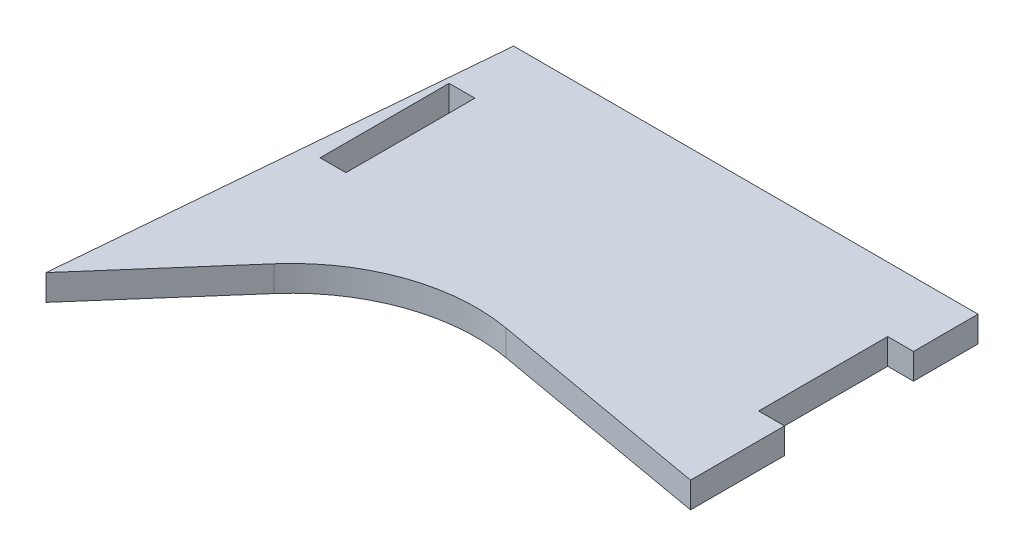
ISO-10303-21;
HEADER;
FILE_DESCRIPTION(('STEP AP214'),'2;1');
FILE_NAME('part.step','',(''),(''),'','','');
FILE_SCHEMA(('AUTOMOTIVE_DESIGN { 1 0 10303 214 1 1 1 1 }'));
ENDSEC;
DATA;
#1=APPLICATION_CONTEXT('core data for automotive mechanical design processes');
#2=APPLICATION_PROTOCOL_DEFINITION('international standard','automotive_design',2000,#1);
#3=PRODUCT_CONTEXT('',#1,'mechanical');
#4=PRODUCT('Part','Part','',(#3));
#5=PRODUCT_RELATED_PRODUCT_CATEGORY('part','',(#4));
#6=PRODUCT_DEFINITION_FORMATION('','',#4);
#7=PRODUCT_DEFINITION_CONTEXT('part definition',#1,'design');
#8=PRODUCT_DEFINITION('design','',#6,#7);
#9=PRODUCT_DEFINITION_SHAPE('','',#8);
#10=(LENGTH_UNIT() NAMED_UNIT(*) SI_UNIT(.MILLI.,.METRE.));
#11=(NAMED_UNIT(*) PLANE_ANGLE_UNIT() SI_UNIT($,.RADIAN.));
#12=(NAMED_UNIT(*) SI_UNIT($,.STERADIAN.) SOLID_ANGLE_UNIT());
#13=UNCERTAINTY_MEASURE_WITH_UNIT(LENGTH_MEASURE(1.E-05),#10,'distance_accuracy_value','');
#14=(GEOMETRIC_REPRESENTATION_CONTEXT(3) GLOBAL_UNCERTAINTY_ASSIGNED_CONTEXT((#13)) GLOBAL_UNIT_ASSIGNED_CONTEXT((#10,
#11,#12)) REPRESENTATION_CONTEXT('',''));
#15=CARTESIAN_POINT('',(0.,0.,0.));
#16=DIRECTION('',(0.,0.,1.));
#17=DIRECTION('',(1.,0.,0.));
#18=AXIS2_PLACEMENT_3D('',#15,#16,#17);
#19=CARTESIAN_POINT('',(-29.8146519361316,3.,50.));
#20=DIRECTION('',(0.,-1.,0.));
#21=DIRECTION('',(0.,0.,-1.));
#22=AXIS2_PLACEMENT_3D('',#19,#20,#21);
#23=PLANE('',#22);
#24=DIRECTION('',(0.,0.,-1.));
#25=VECTOR('',#24,1.);
#26=CARTESIAN_POINT('',(0.,3.,0.));
#27=LINE('',#26,#25);
#28=CARTESIAN_POINT('',(0.,3.,7.5));
#29=VERTEX_POINT('',#28);
#30=CARTESIAN_POINT('',(0.,3.,0.));
#31=VERTEX_POINT('',#30);
#32=EDGE_CURVE('E176',#29,#31,#27,.T.);
#33=ORIENTED_EDGE('',*,*,#32,.T.);
#34=DIRECTION('',(-1.,0.,0.));
#35=VECTOR('',#34,1.);
#36=CARTESIAN_POINT('',(0.,3.,0.));
#37=LINE('',#36,#35);
#38=CARTESIAN_POINT('',(-54.,3.,0.));
#39=VERTEX_POINT('',#38);
#40=EDGE_CURVE('E179',#31,#39,#37,.T.);
#41=ORIENTED_EDGE('',*,*,#40,.T.);
#42=DIRECTION('',(-0.0871557427476548,0.,0.996194698091746));
#43=VECTOR('',#42,1.);
#44=CARTESIAN_POINT('',(-54.,3.,0.));
#45=LINE('',#44,#43);
#46=CARTESIAN_POINT('',(-58.374433176296,3.,50.));
#47=VERTEX_POINT('',#46);
#48=EDGE_CURVE('E182',#39,#47,#45,.T.);
#49=ORIENTED_EDGE('',*,*,#48,.T.);
#50=DIRECTION('',(0.658241438493332,0.,-0.752806886691553));
#51=VECTOR('',#50,1.);
#52=CARTESIAN_POINT('',(-58.374433176296,3.,50.));
#53=LINE('',#52,#51);
#54=CARTESIAN_POINT('',(-46.,3.,35.8478090723934));
#55=VERTEX_POINT('',#54);
#56=EDGE_CURVE('E184',#47,#55,#53,.T.);
#57=ORIENTED_EDGE('',*,*,#56,.T.);
#58=CARTESIAN_POINT('',(-29.8146519361316,3.,50.));
#59=DIRECTION('',(0.,-1.,0.));
#60=DIRECTION('',(0.,0.,-1.));
#61=AXIS2_PLACEMENT_3D('',#58,#59,#60);
#62=CIRCLE('',#61,21.5);
#63=CARTESIAN_POINT('',(-26.0812161162925,3.,28.8266333102375));
#64=VERTEX_POINT('',#63);
#65=EDGE_CURVE('E186',#55,#64,#62,.T.);
#66=ORIENTED_EDGE('',*,*,#65,.T.);
#67=DIRECTION('',(0.984807753012207,0.,0.173648177666934));
#68=VECTOR('',#67,1.);
#69=CARTESIAN_POINT('',(0.,3.,33.4254554012285));
#70=LINE('',#69,#68);
#71=CARTESIAN_POINT('',(0.,3.,33.4254554012285));
#72=VERTEX_POINT('',#71);
#73=EDGE_CURVE('E188',#64,#72,#70,.T.);
#74=ORIENTED_EDGE('',*,*,#73,.T.);
#75=DIRECTION('',(0.,0.,-1.));
#76=VECTOR('',#75,1.);
#77=CARTESIAN_POINT('',(0.,3.,22.5));
#78=LINE('',#77,#76);
#79=CARTESIAN_POINT('',(0.,3.,22.5));
#80=VERTEX_POINT('',#79);
#81=EDGE_CURVE('E190',#72,#80,#78,.T.);
#82=ORIENTED_EDGE('',*,*,#81,.T.);
#83=DIRECTION('',(-1.,0.,0.));
#84=VECTOR('',#83,1.);
#85=CARTESIAN_POINT('',(0.,3.,22.5));
#86=LINE('',#85,#84);
#87=CARTESIAN_POINT('',(-3.,3.,22.5));
#88=VERTEX_POINT('',#87);
#89=EDGE_CURVE('E192',#80,#88,#86,.T.);
#90=ORIENTED_EDGE('',*,*,#89,.T.);
#91=DIRECTION('',(0.,0.,-1.));
#92=VECTOR('',#91,1.);
#93=CARTESIAN_POINT('',(-3.,3.,7.5));
#94=LINE('',#93,#92);
#95=CARTESIAN_POINT('',(-3.,3.,7.5));
#96=VERTEX_POINT('',#95);
#97=EDGE_CURVE('E194',#88,#96,#94,.T.);
#98=ORIENTED_EDGE('',*,*,#97,.T.);
#99=DIRECTION('',(1.,0.,0.));
#100=VECTOR('',#99,1.);
#101=CARTESIAN_POINT('',(0.,3.,7.5));
#102=LINE('',#101,#100);
#103=EDGE_CURVE('E196',#96,#29,#102,.T.);
#104=ORIENTED_EDGE('',*,*,#103,.T.);
#105=EDGE_LOOP('',(#33,#41,#49,#57,#66,#74,#82,#90,#98,#104));
#106=FACE_BOUND('',#105,.T.);
#107=DIRECTION('',(0.,0.,-1.));
#108=VECTOR('',#107,1.);
#109=CARTESIAN_POINT('',(-51.,3.,7.5));
#110=LINE('',#109,#108);
#111=CARTESIAN_POINT('',(-51.,3.,22.5));
#112=VERTEX_POINT('',#111);
#113=CARTESIAN_POINT('',(-51.,3.,7.5));
#114=VERTEX_POINT('',#113);
#115=EDGE_CURVE('E140',#112,#114,#110,.T.);
#116=ORIENTED_EDGE('',*,*,#115,.F.);
#117=DIRECTION('',(1.,0.,0.));
#118=VECTOR('',#117,1.);
#119=CARTESIAN_POINT('',(-54.,3.,22.5));
#120=LINE('',#119,#118);
#121=CARTESIAN_POINT('',(-54.,3.,22.5));
#122=VERTEX_POINT('',#121);
#123=EDGE_CURVE('E162',#122,#112,#120,.T.);
#124=ORIENTED_EDGE('',*,*,#123,.F.);
#125=DIRECTION('',(0.,0.,1.));
#126=VECTOR('',#125,1.);
#127=CARTESIAN_POINT('',(-54.,3.,7.5));
#128=LINE('',#127,#126);
#129=CARTESIAN_POINT('',(-54.,3.,7.5));
#130=VERTEX_POINT('',#129);
#131=EDGE_CURVE('E160',#130,#122,#128,.T.);
#132=ORIENTED_EDGE('',*,*,#131,.F.);
#133=DIRECTION('',(-1.,0.,0.));
#134=VECTOR('',#133,1.);
#135=CARTESIAN_POINT('',(-54.,3.,7.5));
#136=LINE('',#135,#134);
#137=EDGE_CURVE('E148',#114,#130,#136,.T.);
#138=ORIENTED_EDGE('',*,*,#137,.F.);
#139=EDGE_LOOP('',(#116,#124,#132,#138));
#140=FACE_BOUND('',#139,.T.);
#141=ADVANCED_FACE('F39',(#106,#140),#23,.F.);
#142=CARTESIAN_POINT('',(-29.8146519361316,0.,50.));
#143=DIRECTION('',(0.,-1.,0.));
#144=DIRECTION('',(0.,0.,-1.));
#145=AXIS2_PLACEMENT_3D('',#142,#143,#144);
#146=PLANE('',#145);
#147=DIRECTION('',(0.,0.,-1.));
#148=VECTOR('',#147,1.);
#149=CARTESIAN_POINT('',(0.,0.,0.));
#150=LINE('',#149,#148);
#151=CARTESIAN_POINT('',(0.,0.,7.5));
#152=VERTEX_POINT('',#151);
#153=CARTESIAN_POINT('',(0.,0.,0.));
#154=VERTEX_POINT('',#153);
#155=EDGE_CURVE('E156',#152,#154,#150,.T.);
#156=ORIENTED_EDGE('',*,*,#155,.F.);
#157=DIRECTION('',(1.,0.,0.));
#158=VECTOR('',#157,1.);
#159=CARTESIAN_POINT('',(0.,0.,7.5));
#160=LINE('',#159,#158);
#161=CARTESIAN_POINT('',(-3.,0.,7.5));
#162=VERTEX_POINT('',#161);
#163=EDGE_CURVE('E180',#162,#152,#160,.T.);
#164=ORIENTED_EDGE('',*,*,#163,.F.);
#165=DIRECTION('',(0.,0.,-1.));
#166=VECTOR('',#165,1.);
#167=CARTESIAN_POINT('',(-3.,0.,7.5));
#168=LINE('',#167,#166);
#169=CARTESIAN_POINT('',(-3.,0.,22.5));
#170=VERTEX_POINT('',#169);
#171=EDGE_CURVE('E215',#170,#162,#168,.T.);
#172=ORIENTED_EDGE('',*,*,#171,.F.);
#173=DIRECTION('',(-1.,0.,0.));
#174=VECTOR('',#173,1.);
#175=CARTESIAN_POINT('',(0.,0.,22.5));
#176=LINE('',#175,#174);
#177=CARTESIAN_POINT('',(0.,0.,22.5));
#178=VERTEX_POINT('',#177);
#179=EDGE_CURVE('E213',#178,#170,#176,.T.);
#180=ORIENTED_EDGE('',*,*,#179,.F.);
#181=DIRECTION('',(0.,0.,-1.));
#182=VECTOR('',#181,1.);
#183=CARTESIAN_POINT('',(0.,0.,22.5));
#184=LINE('',#183,#182);
#185=CARTESIAN_POINT('',(0.,0.,33.4254554012285));
#186=VERTEX_POINT('',#185);
#187=EDGE_CURVE('E211',#186,#178,#184,.T.);
#188=ORIENTED_EDGE('',*,*,#187,.F.);
#189=DIRECTION('',(0.984807753012207,0.,0.173648177666934));
#190=VECTOR('',#189,1.);
#191=CARTESIAN_POINT('',(0.,0.,33.4254554012285));
#192=LINE('',#191,#190);
#193=CARTESIAN_POINT('',(-26.0812161162925,0.,28.8266333102375));
#194=VERTEX_POINT('',#193);
#195=EDGE_CURVE('E209',#194,#186,#192,.T.);
#196=ORIENTED_EDGE('',*,*,#195,.F.);
#197=CARTESIAN_POINT('',(-29.8146519361316,0.,50.));
#198=DIRECTION('',(0.,-1.,0.));
#199=DIRECTION('',(0.,0.,-1.));
#200=AXIS2_PLACEMENT_3D('',#197,#198,#199);
#201=CIRCLE('',#200,21.5);
#202=CARTESIAN_POINT('',(-46.,0.,35.8478090723934));
#203=VERTEX_POINT('',#202);
#204=EDGE_CURVE('E207',#203,#194,#201,.T.);
#205=ORIENTED_EDGE('',*,*,#204,.F.);
#206=DIRECTION('',(0.658241438493332,0.,-0.752806886691553));
#207=VECTOR('',#206,1.);
#208=CARTESIAN_POINT('',(-58.374433176296,0.,50.));
#209=LINE('',#208,#207);
#210=CARTESIAN_POINT('',(-58.374433176296,0.,50.));
#211=VERTEX_POINT('',#210);
#212=EDGE_CURVE('E205',#211,#203,#209,.T.);
#213=ORIENTED_EDGE('',*,*,#212,.F.);
#214=DIRECTION('',(-0.0871557427476548,0.,0.996194698091746));
#215=VECTOR('',#214,1.);
#216=CARTESIAN_POINT('',(-54.,0.,0.));
#217=LINE('',#216,#215);
#218=CARTESIAN_POINT('',(-54.,0.,0.));
#219=VERTEX_POINT('',#218);
#220=EDGE_CURVE('E203',#219,#211,#217,.T.);
#221=ORIENTED_EDGE('',*,*,#220,.F.);
#222=DIRECTION('',(-1.,0.,0.));
#223=VECTOR('',#222,1.);
#224=CARTESIAN_POINT('',(0.,0.,0.));
#225=LINE('',#224,#223);
#226=EDGE_CURVE('E201',#154,#219,#225,.T.);
#227=ORIENTED_EDGE('',*,*,#226,.F.);
#228=EDGE_LOOP('',(#156,#164,#172,#180,#188,#196,#205,#213,#221,#227));
#229=FACE_BOUND('',#228,.T.);
#230=DIRECTION('',(1.,0.,0.));
#231=VECTOR('',#230,1.);
#232=CARTESIAN_POINT('',(-54.,0.,22.5));
#233=LINE('',#232,#231);
#234=CARTESIAN_POINT('',(-54.,0.,22.5));
#235=VERTEX_POINT('',#234);
#236=CARTESIAN_POINT('',(-51.,0.,22.5));
#237=VERTEX_POINT('',#236);
#238=EDGE_CURVE('E149',#235,#237,#233,.T.);
#239=ORIENTED_EDGE('',*,*,#238,.T.);
#240=DIRECTION('',(0.,0.,-1.));
#241=VECTOR('',#240,1.);
#242=CARTESIAN_POINT('',(-51.,0.,7.5));
#243=LINE('',#242,#241);
#244=CARTESIAN_POINT('',(-51.,0.,7.5));
#245=VERTEX_POINT('',#244);
#246=EDGE_CURVE('E62',#237,#245,#243,.T.);
#247=ORIENTED_EDGE('',*,*,#246,.T.);
#248=DIRECTION('',(-1.,0.,0.));
#249=VECTOR('',#248,1.);
#250=CARTESIAN_POINT('',(-54.,0.,7.5));
#251=LINE('',#250,#249);
#252=CARTESIAN_POINT('',(-54.,0.,7.5));
#253=VERTEX_POINT('',#252);
#254=EDGE_CURVE('E155',#245,#253,#251,.T.);
#255=ORIENTED_EDGE('',*,*,#254,.T.);
#256=DIRECTION('',(0.,0.,1.));
#257=VECTOR('',#256,1.);
#258=CARTESIAN_POINT('',(-54.,0.,7.5));
#259=LINE('',#258,#257);
#260=EDGE_CURVE('E168',#253,#235,#259,.T.);
#261=ORIENTED_EDGE('',*,*,#260,.T.);
#262=EDGE_LOOP('',(#239,#247,#255,#261));
#263=FACE_BOUND('',#262,.T.);
#264=ADVANCED_FACE('F251',(#229,#263),#146,.T.);
#265=CARTESIAN_POINT('',(0.,3.,0.));
#266=DIRECTION('',(-1.,0.,0.));
#267=DIRECTION('',(0.,0.,1.));
#268=AXIS2_PLACEMENT_3D('',#265,#266,#267);
#269=PLANE('',#268);
#270=ORIENTED_EDGE('',*,*,#155,.T.);
#271=DIRECTION('',(0.,-1.,0.));
#272=VECTOR('',#271,1.);
#273=CARTESIAN_POINT('',(0.,3.,0.));
#274=LINE('',#273,#272);
#275=EDGE_CURVE('E11',#31,#154,#274,.T.);
#276=ORIENTED_EDGE('',*,*,#275,.F.);
#277=ORIENTED_EDGE('',*,*,#32,.F.);
#278=DIRECTION('',(0.,-1.,0.));
#279=VECTOR('',#278,1.);
#280=CARTESIAN_POINT('',(0.,3.,7.5));
#281=LINE('',#280,#279);
#282=EDGE_CURVE('E198',#29,#152,#281,.T.);
#283=ORIENTED_EDGE('',*,*,#282,.T.);
#284=EDGE_LOOP('',(#270,#276,#277,#283));
#285=FACE_BOUND('',#284,.T.);
#286=ADVANCED_FACE('F41',(#285),#269,.F.);
#287=CARTESIAN_POINT('',(0.,3.,0.));
#288=DIRECTION('',(0.,0.,1.));
#289=DIRECTION('',(1.,0.,0.));
#290=AXIS2_PLACEMENT_3D('',#287,#288,#289);
#291=PLANE('',#290);
#292=ORIENTED_EDGE('',*,*,#226,.T.);
#293=DIRECTION('',(0.,-1.,0.));
#294=VECTOR('',#293,1.);
#295=CARTESIAN_POINT('',(-54.,3.,0.));
#296=LINE('',#295,#294);
#297=EDGE_CURVE('E47',#39,#219,#296,.T.);
#298=ORIENTED_EDGE('',*,*,#297,.F.);
#299=ORIENTED_EDGE('',*,*,#40,.F.);
#300=ORIENTED_EDGE('',*,*,#275,.T.);
#301=EDGE_LOOP('',(#292,#298,#299,#300));
#302=FACE_BOUND('',#301,.T.);
#303=ADVANCED_FACE('F268',(#302),#291,.F.);
#304=CARTESIAN_POINT('',(-54.,3.,0.));
#305=DIRECTION('',(0.996194698091746,0.,0.0871557427476548));
#306=DIRECTION('',(0.0871557427476548,0.,-0.996194698091746));
#307=AXIS2_PLACEMENT_3D('',#304,#305,#306);
#308=PLANE('',#307);
#309=ORIENTED_EDGE('',*,*,#220,.T.);
#310=DIRECTION('',(0.,-1.,0.));
#311=VECTOR('',#310,1.);
#312=CARTESIAN_POINT('',(-58.374433176296,3.,50.));
#313=LINE('',#312,#311);
#314=EDGE_CURVE('E238',#47,#211,#313,.T.);
#315=ORIENTED_EDGE('',*,*,#314,.F.);
#316=ORIENTED_EDGE('',*,*,#48,.F.);
#317=ORIENTED_EDGE('',*,*,#297,.T.);
#318=EDGE_LOOP('',(#309,#315,#316,#317));
#319=FACE_BOUND('',#318,.T.);
#320=ADVANCED_FACE('F245',(#319),#308,.F.);
#321=CARTESIAN_POINT('',(-58.374433176296,3.,50.));
#322=DIRECTION('',(-0.752806886691553,0.,-0.658241438493332));
#323=DIRECTION('',(-0.658241438493332,0.,0.752806886691553));
#324=AXIS2_PLACEMENT_3D('',#321,#322,#323);
#325=PLANE('',#324);
#326=ORIENTED_EDGE('',*,*,#212,.T.);
#327=DIRECTION('',(0.,-1.,0.));
#328=VECTOR('',#327,1.);
#329=CARTESIAN_POINT('',(-46.,3.,35.8478090723934));
#330=LINE('',#329,#328);
#331=EDGE_CURVE('E235',#55,#203,#330,.T.);
#332=ORIENTED_EDGE('',*,*,#331,.F.);
#333=ORIENTED_EDGE('',*,*,#56,.F.);
#334=ORIENTED_EDGE('',*,*,#314,.T.);
#335=EDGE_LOOP('',(#326,#332,#333,#334));
#336=FACE_BOUND('',#335,.T.);
#337=ADVANCED_FACE('F257',(#336),#325,.F.);
#338=CARTESIAN_POINT('',(-29.8146519361316,3.,50.));
#339=DIRECTION('',(0.,-1.,0.));
#340=DIRECTION('',(0.,0.,-1.));
#341=AXIS2_PLACEMENT_3D('',#338,#339,#340);
#342=CYLINDRICAL_SURFACE('',#341,21.5);
#343=ORIENTED_EDGE('',*,*,#204,.T.);
#344=DIRECTION('',(0.,-1.,0.));
#345=VECTOR('',#344,1.);
#346=CARTESIAN_POINT('',(-26.0812161162925,3.,28.8266333102375));
#347=LINE('',#346,#345);
#348=EDGE_CURVE('E232',#64,#194,#347,.T.);
#349=ORIENTED_EDGE('',*,*,#348,.F.);
#350=ORIENTED_EDGE('',*,*,#65,.F.);
#351=ORIENTED_EDGE('',*,*,#331,.T.);
#352=EDGE_LOOP('',(#343,#349,#350,#351));
#353=FACE_BOUND('',#352,.T.);
#354=ADVANCED_FACE('F261',(#353),#342,.F.);
#355=CARTESIAN_POINT('',(0.,3.,33.4254554012285));
#356=DIRECTION('',(0.173648177666934,0.,-0.984807753012207));
#357=DIRECTION('',(-0.984807753012207,0.,-0.173648177666934));
#358=AXIS2_PLACEMENT_3D('',#355,#356,#357);
#359=PLANE('',#358);
#360=ORIENTED_EDGE('',*,*,#195,.T.);
#361=DIRECTION('',(0.,-1.,0.));
#362=VECTOR('',#361,1.);
#363=CARTESIAN_POINT('',(0.,3.,33.4254554012285));
#364=LINE('',#363,#362);
#365=EDGE_CURVE('E229',#72,#186,#364,.T.);
#366=ORIENTED_EDGE('',*,*,#365,.F.);
#367=ORIENTED_EDGE('',*,*,#73,.F.);
#368=ORIENTED_EDGE('',*,*,#348,.T.);
#369=EDGE_LOOP('',(#360,#366,#367,#368));
#370=FACE_BOUND('',#369,.T.);
#371=ADVANCED_FACE('F291',(#370),#359,.F.);
#372=CARTESIAN_POINT('',(0.,3.,22.5));
#373=DIRECTION('',(-1.,0.,0.));
#374=DIRECTION('',(0.,0.,1.));
#375=AXIS2_PLACEMENT_3D('',#372,#373,#374);
#376=PLANE('',#375);
#377=ORIENTED_EDGE('',*,*,#187,.T.);
#378=DIRECTION('',(0.,-1.,0.));
#379=VECTOR('',#378,1.);
#380=CARTESIAN_POINT('',(0.,3.,22.5));
#381=LINE('',#380,#379);
#382=EDGE_CURVE('E226',#80,#178,#381,.T.);
#383=ORIENTED_EDGE('',*,*,#382,.F.);
#384=ORIENTED_EDGE('',*,*,#81,.F.);
#385=ORIENTED_EDGE('',*,*,#365,.T.);
#386=EDGE_LOOP('',(#377,#383,#384,#385));
#387=FACE_BOUND('',#386,.T.);
#388=ADVANCED_FACE('F288',(#387),#376,.F.);
#389=CARTESIAN_POINT('',(0.,3.,22.5));
#390=DIRECTION('',(0.,0.,1.));
#391=DIRECTION('',(1.,0.,0.));
#392=AXIS2_PLACEMENT_3D('',#389,#390,#391);
#393=PLANE('',#392);
#394=ORIENTED_EDGE('',*,*,#179,.T.);
#395=DIRECTION('',(0.,-1.,0.));
#396=VECTOR('',#395,1.);
#397=CARTESIAN_POINT('',(-3.,3.,22.5));
#398=LINE('',#397,#396);
#399=EDGE_CURVE('E223',#88,#170,#398,.T.);
#400=ORIENTED_EDGE('',*,*,#399,.F.);
#401=ORIENTED_EDGE('',*,*,#89,.F.);
#402=ORIENTED_EDGE('',*,*,#382,.T.);
#403=EDGE_LOOP('',(#394,#400,#401,#402));
#404=FACE_BOUND('',#403,.T.);
#405=ADVANCED_FACE('F284',(#404),#393,.F.);
#406=CARTESIAN_POINT('',(-3.,3.,7.5));
#407=DIRECTION('',(-1.,0.,0.));
#408=DIRECTION('',(0.,0.,1.));
#409=AXIS2_PLACEMENT_3D('',#406,#407,#408);
#410=PLANE('',#409);
#411=ORIENTED_EDGE('',*,*,#171,.T.);
#412=DIRECTION('',(0.,-1.,0.));
#413=VECTOR('',#412,1.);
#414=CARTESIAN_POINT('',(-3.,3.,7.5));
#415=LINE('',#414,#413);
#416=EDGE_CURVE('E220',#96,#162,#415,.T.);
#417=ORIENTED_EDGE('',*,*,#416,.F.);
#418=ORIENTED_EDGE('',*,*,#97,.F.);
#419=ORIENTED_EDGE('',*,*,#399,.T.);
#420=EDGE_LOOP('',(#411,#417,#418,#419));
#421=FACE_BOUND('',#420,.T.);
#422=ADVANCED_FACE('F280',(#421),#410,.F.);
#423=CARTESIAN_POINT('',(0.,3.,7.5));
#424=DIRECTION('',(0.,0.,-1.));
#425=DIRECTION('',(-1.,0.,0.));
#426=AXIS2_PLACEMENT_3D('',#423,#424,#425);
#427=PLANE('',#426);
#428=ORIENTED_EDGE('',*,*,#163,.T.);
#429=ORIENTED_EDGE('',*,*,#282,.F.);
#430=ORIENTED_EDGE('',*,*,#103,.F.);
#431=ORIENTED_EDGE('',*,*,#416,.T.);
#432=EDGE_LOOP('',(#428,#429,#430,#431));
#433=FACE_BOUND('',#432,.T.);
#434=ADVANCED_FACE('F275',(#433),#427,.F.);
#435=CARTESIAN_POINT('',(-51.,3.,7.5));
#436=DIRECTION('',(-1.,0.,0.));
#437=DIRECTION('',(0.,0.,1.));
#438=AXIS2_PLACEMENT_3D('',#435,#436,#437);
#439=PLANE('',#438);
#440=ORIENTED_EDGE('',*,*,#246,.F.);
#441=DIRECTION('',(0.,-1.,0.));
#442=VECTOR('',#441,1.);
#443=CARTESIAN_POINT('',(-51.,3.,22.5));
#444=LINE('',#443,#442);
#445=EDGE_CURVE('E144',#112,#237,#444,.T.);
#446=ORIENTED_EDGE('',*,*,#445,.F.);
#447=ORIENTED_EDGE('',*,*,#115,.T.);
#448=DIRECTION('',(0.,-1.,0.));
#449=VECTOR('',#448,1.);
#450=CARTESIAN_POINT('',(-51.,3.,7.5));
#451=LINE('',#450,#449);
#452=EDGE_CURVE('E143',#114,#245,#451,.T.);
#453=ORIENTED_EDGE('',*,*,#452,.T.);
#454=EDGE_LOOP('',(#440,#446,#447,#453));
#455=FACE_BOUND('',#454,.T.);
#456=ADVANCED_FACE('F142',(#455),#439,.T.);
#457=CARTESIAN_POINT('',(-54.,3.,7.5));
#458=DIRECTION('',(0.,0.,1.));
#459=DIRECTION('',(1.,0.,0.));
#460=AXIS2_PLACEMENT_3D('',#457,#458,#459);
#461=PLANE('',#460);
#462=ORIENTED_EDGE('',*,*,#254,.F.);
#463=ORIENTED_EDGE('',*,*,#452,.F.);
#464=ORIENTED_EDGE('',*,*,#137,.T.);
#465=DIRECTION('',(0.,-1.,0.));
#466=VECTOR('',#465,1.);
#467=CARTESIAN_POINT('',(-54.,3.,7.5));
#468=LINE('',#467,#466);
#469=EDGE_CURVE('E157',#130,#253,#468,.T.);
#470=ORIENTED_EDGE('',*,*,#469,.T.);
#471=EDGE_LOOP('',(#462,#463,#464,#470));
#472=FACE_BOUND('',#471,.T.);
#473=ADVANCED_FACE('F152',(#472),#461,.T.);
#474=CARTESIAN_POINT('',(-54.,3.,7.5));
#475=DIRECTION('',(1.,0.,0.));
#476=DIRECTION('',(0.,0.,-1.));
#477=AXIS2_PLACEMENT_3D('',#474,#475,#476);
#478=PLANE('',#477);
#479=ORIENTED_EDGE('',*,*,#260,.F.);
#480=ORIENTED_EDGE('',*,*,#469,.F.);
#481=ORIENTED_EDGE('',*,*,#131,.T.);
#482=DIRECTION('',(0.,-1.,0.));
#483=VECTOR('',#482,1.);
#484=CARTESIAN_POINT('',(-54.,3.,22.5));
#485=LINE('',#484,#483);
#486=EDGE_CURVE('E54',#122,#235,#485,.T.);
#487=ORIENTED_EDGE('',*,*,#486,.T.);
#488=EDGE_LOOP('',(#479,#480,#481,#487));
#489=FACE_BOUND('',#488,.T.);
#490=ADVANCED_FACE('F341',(#489),#478,.T.);
#491=CARTESIAN_POINT('',(-54.,3.,22.5));
#492=DIRECTION('',(0.,0.,-1.));
#493=DIRECTION('',(-1.,0.,0.));
#494=AXIS2_PLACEMENT_3D('',#491,#492,#493);
#495=PLANE('',#494);
#496=ORIENTED_EDGE('',*,*,#238,.F.);
#497=ORIENTED_EDGE('',*,*,#486,.F.);
#498=ORIENTED_EDGE('',*,*,#123,.T.);
#499=ORIENTED_EDGE('',*,*,#445,.T.);
#500=EDGE_LOOP('',(#496,#497,#498,#499));
#501=FACE_BOUND('',#500,.T.);
#502=ADVANCED_FACE('F348',(#501),#495,.T.);
#503=CLOSED_SHELL('',(#141,#264,#286,#303,#320,#337,#354,#371,#388,#405,#422,#434,#456,#473,
#490,#502));
#504=MANIFOLD_SOLID_BREP('B2',#503);
#505=ADVANCED_BREP_SHAPE_REPRESENTATION('',(#18,#504),#14);
#506=SHAPE_DEFINITION_REPRESENTATION(#9,#505);
ENDSEC;
END-ISO-10303-21;
